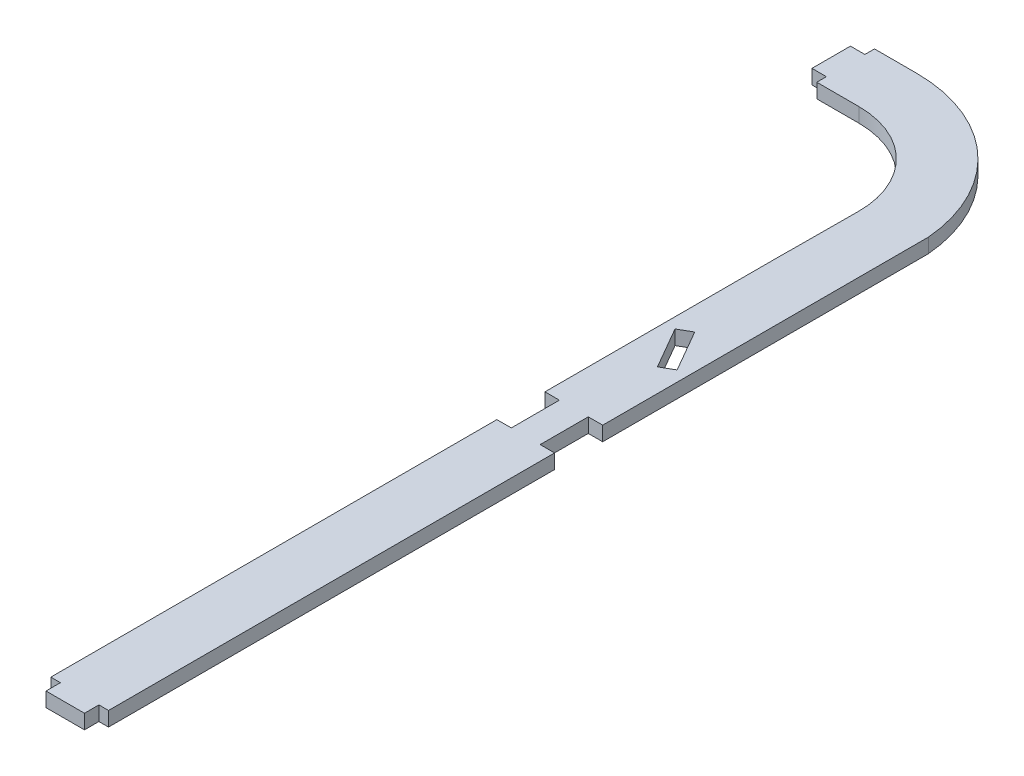
ISO-10303-21;
HEADER;
FILE_DESCRIPTION(('STEP AP214'),'2;1');
FILE_NAME('part.step','',(''),(''),'','','');
FILE_SCHEMA(('AUTOMOTIVE_DESIGN { 1 0 10303 214 1 1 1 1 }'));
ENDSEC;
DATA;
#1=APPLICATION_CONTEXT('core data for automotive mechanical design processes');
#2=APPLICATION_PROTOCOL_DEFINITION('international standard','automotive_design',2000,#1);
#3=PRODUCT_CONTEXT('',#1,'mechanical');
#4=PRODUCT('Part','Part','',(#3));
#5=PRODUCT_RELATED_PRODUCT_CATEGORY('part','',(#4));
#6=PRODUCT_DEFINITION_FORMATION('','',#4);
#7=PRODUCT_DEFINITION_CONTEXT('part definition',#1,'design');
#8=PRODUCT_DEFINITION('design','',#6,#7);
#9=PRODUCT_DEFINITION_SHAPE('','',#8);
#10=(LENGTH_UNIT() NAMED_UNIT(*) SI_UNIT(.MILLI.,.METRE.));
#11=(NAMED_UNIT(*) PLANE_ANGLE_UNIT() SI_UNIT($,.RADIAN.));
#12=(NAMED_UNIT(*) SI_UNIT($,.STERADIAN.) SOLID_ANGLE_UNIT());
#13=UNCERTAINTY_MEASURE_WITH_UNIT(LENGTH_MEASURE(1.E-05),#10,'distance_accuracy_value','');
#14=(GEOMETRIC_REPRESENTATION_CONTEXT(3) GLOBAL_UNCERTAINTY_ASSIGNED_CONTEXT((#13)) GLOBAL_UNIT_ASSIGNED_CONTEXT((#10,
#11,#12)) REPRESENTATION_CONTEXT('',''));
#15=CARTESIAN_POINT('',(0.,0.,0.));
#16=DIRECTION('',(0.,0.,1.));
#17=DIRECTION('',(1.,0.,0.));
#18=AXIS2_PLACEMENT_3D('',#15,#16,#17);
#19=CARTESIAN_POINT('',(43.2832423205118,3.,74.9687748154234));
#20=DIRECTION('',(0.500000000000092,0.,0.866025403784385));
#21=DIRECTION('',(0.866025403784385,0.,-0.500000000000093));
#22=AXIS2_PLACEMENT_3D('',#19,#20,#21);
#23=PLANE('',#22);
#24=DIRECTION('',(-0.866025403784385,0.,0.500000000000093));
#25=VECTOR('',#24,1.);
#26=CARTESIAN_POINT('',(43.2832423205118,0.,74.9687748154234));
#27=LINE('',#26,#25);
#28=CARTESIAN_POINT('',(69.7990381056764,0.,59.6598729810778));
#29=VERTEX_POINT('',#28);
#30=CARTESIAN_POINT('',(67.2009618943232,0.,61.159872981078));
#31=VERTEX_POINT('',#30);
#32=EDGE_CURVE('E322',#29,#31,#27,.T.);
#33=ORIENTED_EDGE('',*,*,#32,.F.);
#34=DIRECTION('',(0.,-1.,0.));
#35=VECTOR('',#34,1.);
#36=CARTESIAN_POINT('',(69.7990381056764,3.,59.6598729810778));
#37=LINE('',#36,#35);
#38=CARTESIAN_POINT('',(69.7990381056764,3.,59.6598729810778));
#39=VERTEX_POINT('',#38);
#40=EDGE_CURVE('E11',#39,#29,#37,.T.);
#41=ORIENTED_EDGE('',*,*,#40,.F.);
#42=DIRECTION('',(-0.866025403784385,0.,0.500000000000093));
#43=VECTOR('',#42,1.);
#44=CARTESIAN_POINT('',(43.2832423205118,3.,74.9687748154234));
#45=LINE('',#44,#43);
#46=CARTESIAN_POINT('',(67.2009618943232,3.,61.159872981078));
#47=VERTEX_POINT('',#46);
#48=EDGE_CURVE('E246',#39,#47,#45,.T.);
#49=ORIENTED_EDGE('',*,*,#48,.T.);
#50=DIRECTION('',(0.,-1.,0.));
#51=VECTOR('',#50,1.);
#52=CARTESIAN_POINT('',(67.2009618943232,3.,61.159872981078));
#53=LINE('',#52,#51);
#54=EDGE_CURVE('E54',#47,#31,#53,.T.);
#55=ORIENTED_EDGE('',*,*,#54,.T.);
#56=EDGE_LOOP('',(#33,#41,#49,#55));
#57=FACE_BOUND('',#56,.T.);
#58=ADVANCED_FACE('F35',(#57),#23,.T.);
#59=CARTESIAN_POINT('',(26.5157957851646,3.,-15.3089018343457));
#60=DIRECTION('',(0.866025403784386,0.,-0.500000000000092));
#61=DIRECTION('',(-0.500000000000092,0.,-0.866025403784386));
#62=AXIS2_PLACEMENT_3D('',#59,#60,#61);
#63=PLANE('',#62);
#64=DIRECTION('',(0.500000000000092,0.,0.866025403784386));
#65=VECTOR('',#64,1.);
#66=CARTESIAN_POINT('',(26.5157957851646,0.,-15.3089018343457));
#67=LINE('',#66,#65);
#68=CARTESIAN_POINT('',(74.7990381056773,0.,68.3201270189217));
#69=VERTEX_POINT('',#68);
#70=EDGE_CURVE('E251',#29,#69,#67,.T.);
#71=ORIENTED_EDGE('',*,*,#70,.T.);
#72=DIRECTION('',(0.,-1.,0.));
#73=VECTOR('',#72,1.);
#74=CARTESIAN_POINT('',(74.7990381056773,3.,68.3201270189217));
#75=LINE('',#74,#73);
#76=CARTESIAN_POINT('',(74.7990381056773,3.,68.3201270189217));
#77=VERTEX_POINT('',#76);
#78=EDGE_CURVE('E45',#77,#69,#75,.T.);
#79=ORIENTED_EDGE('',*,*,#78,.F.);
#80=DIRECTION('',(0.500000000000092,0.,0.866025403784386));
#81=VECTOR('',#80,1.);
#82=CARTESIAN_POINT('',(26.5157957851646,3.,-15.3089018343457));
#83=LINE('',#82,#81);
#84=EDGE_CURVE('E241',#39,#77,#83,.T.);
#85=ORIENTED_EDGE('',*,*,#84,.F.);
#86=ORIENTED_EDGE('',*,*,#40,.T.);
#87=EDGE_LOOP('',(#71,#79,#85,#86));
#88=FACE_BOUND('',#87,.T.);
#89=ADVANCED_FACE('F249',(#88),#63,.F.);
#90=CARTESIAN_POINT('',(48.2832423205124,3.,83.6290288532674));
#91=DIRECTION('',(0.500000000000089,0.,0.866025403784387));
#92=DIRECTION('',(0.866025403784387,0.,-0.500000000000089));
#93=AXIS2_PLACEMENT_3D('',#90,#91,#92);
#94=PLANE('',#93);
#95=DIRECTION('',(-0.866025403784387,0.,0.500000000000089));
#96=VECTOR('',#95,1.);
#97=CARTESIAN_POINT('',(48.2832423205124,0.,83.6290288532674));
#98=LINE('',#97,#96);
#99=CARTESIAN_POINT('',(72.2009618943241,0.,69.820127018922));
#100=VERTEX_POINT('',#99);
#101=EDGE_CURVE('E319',#69,#100,#98,.T.);
#102=ORIENTED_EDGE('',*,*,#101,.T.);
#103=DIRECTION('',(0.,-1.,0.));
#104=VECTOR('',#103,1.);
#105=CARTESIAN_POINT('',(72.2009618943241,3.,69.820127018922));
#106=LINE('',#105,#104);
#107=CARTESIAN_POINT('',(72.2009618943241,3.,69.820127018922));
#108=VERTEX_POINT('',#107);
#109=EDGE_CURVE('E143',#108,#100,#106,.T.);
#110=ORIENTED_EDGE('',*,*,#109,.F.);
#111=DIRECTION('',(-0.866025403784387,0.,0.500000000000089));
#112=VECTOR('',#111,1.);
#113=CARTESIAN_POINT('',(48.2832423205124,3.,83.6290288532674));
#114=LINE('',#113,#112);
#115=EDGE_CURVE('E233',#77,#108,#114,.T.);
#116=ORIENTED_EDGE('',*,*,#115,.F.);
#117=ORIENTED_EDGE('',*,*,#78,.T.);
#118=EDGE_LOOP('',(#102,#110,#116,#117));
#119=FACE_BOUND('',#118,.T.);
#120=ADVANCED_FACE('F235',(#119),#94,.F.);
#121=CARTESIAN_POINT('',(34.51,3.,0.));
#122=DIRECTION('',(-1.,0.,0.));
#123=DIRECTION('',(0.,0.,1.));
#124=AXIS2_PLACEMENT_3D('',#121,#122,#123);
#125=PLANE('',#124);
#126=DIRECTION('',(0.,0.,-1.));
#127=VECTOR('',#126,1.);
#128=CARTESIAN_POINT('',(34.51,0.,0.));
#129=LINE('',#128,#127);
#130=CARTESIAN_POINT('',(34.51,0.,0.));
#131=VERTEX_POINT('',#130);
#132=CARTESIAN_POINT('',(34.51,0.,-8.));
#133=VERTEX_POINT('',#132);
#134=EDGE_CURVE('E390',#131,#133,#129,.T.);
#135=ORIENTED_EDGE('',*,*,#134,.F.);
#136=DIRECTION('',(0.,-1.,0.));
#137=VECTOR('',#136,1.);
#138=CARTESIAN_POINT('',(34.51,3.,0.));
#139=LINE('',#138,#137);
#140=CARTESIAN_POINT('',(34.51,3.,0.));
#141=VERTEX_POINT('',#140);
#142=EDGE_CURVE('E39',#141,#131,#139,.T.);
#143=ORIENTED_EDGE('',*,*,#142,.F.);
#144=DIRECTION('',(0.,0.,-1.));
#145=VECTOR('',#144,1.);
#146=CARTESIAN_POINT('',(34.51,3.,0.));
#147=LINE('',#146,#145);
#148=CARTESIAN_POINT('',(34.51,3.,-8.));
#149=VERTEX_POINT('',#148);
#150=EDGE_CURVE('E318',#141,#149,#147,.T.);
#151=ORIENTED_EDGE('',*,*,#150,.T.);
#152=DIRECTION('',(0.,-1.,0.));
#153=VECTOR('',#152,1.);
#154=CARTESIAN_POINT('',(34.51,3.,-8.));
#155=LINE('',#154,#153);
#156=EDGE_CURVE('E256',#149,#133,#155,.T.);
#157=ORIENTED_EDGE('',*,*,#156,.T.);
#158=EDGE_LOOP('',(#135,#143,#151,#157));
#159=FACE_BOUND('',#158,.T.);
#160=ADVANCED_FACE('F37',(#159),#125,.T.);
#161=CARTESIAN_POINT('',(0.,3.,0.));
#162=DIRECTION('',(0.,0.,-1.));
#163=DIRECTION('',(-1.,0.,0.));
#164=AXIS2_PLACEMENT_3D('',#161,#162,#163);
#165=PLANE('',#164);
#166=DIRECTION('',(1.,0.,0.));
#167=VECTOR('',#166,1.);
#168=CARTESIAN_POINT('',(0.,0.,0.));
#169=LINE('',#168,#167);
#170=CARTESIAN_POINT('',(37.51,0.,0.));
#171=VERTEX_POINT('',#170);
#172=EDGE_CURVE('E388',#131,#171,#169,.T.);
#173=ORIENTED_EDGE('',*,*,#172,.T.);
#174=DIRECTION('',(0.,-1.,0.));
#175=VECTOR('',#174,1.);
#176=CARTESIAN_POINT('',(37.51,3.,0.));
#177=LINE('',#176,#175);
#178=CARTESIAN_POINT('',(37.51,3.,0.));
#179=VERTEX_POINT('',#178);
#180=EDGE_CURVE('E306',#179,#171,#177,.T.);
#181=ORIENTED_EDGE('',*,*,#180,.F.);
#182=DIRECTION('',(1.,0.,0.));
#183=VECTOR('',#182,1.);
#184=CARTESIAN_POINT('',(0.,3.,0.));
#185=LINE('',#184,#183);
#186=EDGE_CURVE('E454',#141,#179,#185,.T.);
#187=ORIENTED_EDGE('',*,*,#186,.F.);
#188=ORIENTED_EDGE('',*,*,#142,.T.);
#189=EDGE_LOOP('',(#173,#181,#187,#188));
#190=FACE_BOUND('',#189,.T.);
#191=ADVANCED_FACE('F469',(#190),#165,.F.);
#192=CARTESIAN_POINT('',(37.51,3.,0.));
#193=DIRECTION('',(1.,0.,0.));
#194=DIRECTION('',(0.,0.,-1.));
#195=AXIS2_PLACEMENT_3D('',#192,#193,#194);
#196=PLANE('',#195);
#197=DIRECTION('',(0.,0.,1.));
#198=VECTOR('',#197,1.);
#199=CARTESIAN_POINT('',(37.51,0.,0.));
#200=LINE('',#199,#198);
#201=CARTESIAN_POINT('',(37.51,0.,2.));
#202=VERTEX_POINT('',#201);
#203=EDGE_CURVE('E386',#171,#202,#200,.T.);
#204=ORIENTED_EDGE('',*,*,#203,.T.);
#205=DIRECTION('',(0.,-1.,0.));
#206=VECTOR('',#205,1.);
#207=CARTESIAN_POINT('',(37.51,3.,2.));
#208=LINE('',#207,#206);
#209=CARTESIAN_POINT('',(37.51,3.,2.));
#210=VERTEX_POINT('',#209);
#211=EDGE_CURVE('E304',#210,#202,#208,.T.);
#212=ORIENTED_EDGE('',*,*,#211,.F.);
#213=DIRECTION('',(0.,0.,1.));
#214=VECTOR('',#213,1.);
#215=CARTESIAN_POINT('',(37.51,3.,0.));
#216=LINE('',#215,#214);
#217=EDGE_CURVE('E452',#179,#210,#216,.T.);
#218=ORIENTED_EDGE('',*,*,#217,.F.);
#219=ORIENTED_EDGE('',*,*,#180,.T.);
#220=EDGE_LOOP('',(#204,#212,#218,#219));
#221=FACE_BOUND('',#220,.T.);
#222=ADVANCED_FACE('F471',(#221),#196,.F.);
#223=CARTESIAN_POINT('',(0.,3.,2.00000000000001));
#224=DIRECTION('',(0.,0.,-1.));
#225=DIRECTION('',(-1.,0.,0.));
#226=AXIS2_PLACEMENT_3D('',#223,#224,#225);
#227=PLANE('',#226);
#228=DIRECTION('',(1.,0.,0.));
#229=VECTOR('',#228,1.);
#230=CARTESIAN_POINT('',(0.,0.,2.00000000000001));
#231=LINE('',#230,#229);
#232=CARTESIAN_POINT('',(46.2512626584709,0.,2.));
#233=VERTEX_POINT('',#232);
#234=EDGE_CURVE('E383',#202,#233,#231,.T.);
#235=ORIENTED_EDGE('',*,*,#234,.T.);
#236=DIRECTION('',(0.,-1.,0.));
#237=VECTOR('',#236,1.);
#238=CARTESIAN_POINT('',(46.2512626584709,3.,2.));
#239=LINE('',#238,#237);
#240=CARTESIAN_POINT('',(46.2512626584709,3.,2.));
#241=VERTEX_POINT('',#240);
#242=EDGE_CURVE('E302',#241,#233,#239,.T.);
#243=ORIENTED_EDGE('',*,*,#242,.F.);
#244=DIRECTION('',(1.,0.,0.));
#245=VECTOR('',#244,1.);
#246=CARTESIAN_POINT('',(0.,3.,2.00000000000001));
#247=LINE('',#246,#245);
#248=EDGE_CURVE('E450',#210,#241,#247,.T.);
#249=ORIENTED_EDGE('',*,*,#248,.F.);
#250=ORIENTED_EDGE('',*,*,#211,.T.);
#251=EDGE_LOOP('',(#235,#243,#249,#250));
#252=FACE_BOUND('',#251,.T.);
#253=ADVANCED_FACE('F477',(#252),#227,.F.);
#254=CARTESIAN_POINT('',(46.2512626584709,3.,20.8556892131869));
#255=DIRECTION('',(0.,-1.,0.));
#256=DIRECTION('',(0.,0.,-1.));
#257=AXIS2_PLACEMENT_3D('',#254,#255,#256);
#258=CYLINDRICAL_SURFACE('',#257,18.8556892131869);
#259=CARTESIAN_POINT('',(46.2512626584709,0.,20.8556892131869));
#260=DIRECTION('',(0.,1.,0.));
#261=DIRECTION('',(0.,0.,1.));
#262=AXIS2_PLACEMENT_3D('',#259,#260,#261);
#263=CIRCLE('',#262,18.8556892131869);
#264=CARTESIAN_POINT('',(65.1055715405771,0.,21.0838389062047));
#265=VERTEX_POINT('',#264);
#266=EDGE_CURVE('E380',#265,#233,#263,.T.);
#267=ORIENTED_EDGE('',*,*,#266,.F.);
#268=DIRECTION('',(0.,-1.,0.));
#269=VECTOR('',#268,1.);
#270=CARTESIAN_POINT('',(65.1055715405771,3.,21.0838389062047));
#271=LINE('',#270,#269);
#272=CARTESIAN_POINT('',(65.1055715405771,3.,21.0838389062047));
#273=VERTEX_POINT('',#272);
#274=EDGE_CURVE('E300',#273,#265,#271,.T.);
#275=ORIENTED_EDGE('',*,*,#274,.F.);
#276=CARTESIAN_POINT('',(46.2512626584709,3.,20.8556892131869));
#277=DIRECTION('',(0.,1.,0.));
#278=DIRECTION('',(0.,0.,1.));
#279=AXIS2_PLACEMENT_3D('',#276,#277,#278);
#280=CIRCLE('',#279,18.8556892131869);
#281=EDGE_CURVE('E447',#273,#241,#280,.T.);
#282=ORIENTED_EDGE('',*,*,#281,.T.);
#283=ORIENTED_EDGE('',*,*,#242,.T.);
#284=EDGE_LOOP('',(#267,#275,#282,#283));
#285=FACE_BOUND('',#284,.T.);
#286=ADVANCED_FACE('F480',(#285),#258,.F.);
#287=CARTESIAN_POINT('',(65.2307434204492,3.,0.394653270711115));
#288=DIRECTION('',(-0.999981698577864,0.,-0.00605000077112861));
#289=DIRECTION('',(-0.00605000077112861,0.,0.999981698577864));
#290=AXIS2_PLACEMENT_3D('',#287,#288,#289);
#291=PLANE('',#290);
#292=DIRECTION('',(0.00605000077112861,0.,-0.999981698577864));
#293=VECTOR('',#292,1.);
#294=CARTESIAN_POINT('',(65.2307434204492,0.,0.394653270711115));
#295=LINE('',#294,#293);
#296=CARTESIAN_POINT('',(65.0000000000002,0.,38.5333587428506));
#297=VERTEX_POINT('',#296);
#298=EDGE_CURVE('E377',#297,#265,#295,.T.);
#299=ORIENTED_EDGE('',*,*,#298,.F.);
#300=DIRECTION('',(0.,-1.,0.));
#301=VECTOR('',#300,1.);
#302=CARTESIAN_POINT('',(65.0000000000002,3.,38.5333587428506));
#303=LINE('',#302,#301);
#304=CARTESIAN_POINT('',(65.0000000000002,3.,38.5333587428506));
#305=VERTEX_POINT('',#304);
#306=EDGE_CURVE('E298',#305,#297,#303,.T.);
#307=ORIENTED_EDGE('',*,*,#306,.F.);
#308=DIRECTION('',(0.00605000077112861,0.,-0.999981698577864));
#309=VECTOR('',#308,1.);
#310=CARTESIAN_POINT('',(65.2307434204492,3.,0.394653270711115));
#311=LINE('',#310,#309);
#312=EDGE_CURVE('E444',#305,#273,#311,.T.);
#313=ORIENTED_EDGE('',*,*,#312,.T.);
#314=ORIENTED_EDGE('',*,*,#274,.T.);
#315=EDGE_LOOP('',(#299,#307,#313,#314));
#316=FACE_BOUND('',#315,.T.);
#317=ADVANCED_FACE('F483',(#316),#291,.T.);
#318=CARTESIAN_POINT('',(65.0000000000003,3.,2.28048039705462E-13));
#319=DIRECTION('',(-1.,0.,0.));
#320=DIRECTION('',(0.,0.,1.));
#321=AXIS2_PLACEMENT_3D('',#318,#319,#320);
#322=PLANE('',#321);
#323=DIRECTION('',(0.,0.,-1.));
#324=VECTOR('',#323,1.);
#325=CARTESIAN_POINT('',(65.0000000000003,0.,2.28048039705462E-13));
#326=LINE('',#325,#324);
#327=CARTESIAN_POINT('',(65.,0.,86.));
#328=VERTEX_POINT('',#327);
#329=EDGE_CURVE('E374',#328,#297,#326,.T.);
#330=ORIENTED_EDGE('',*,*,#329,.F.);
#331=DIRECTION('',(0.,-1.,0.));
#332=VECTOR('',#331,1.);
#333=CARTESIAN_POINT('',(65.,3.,86.));
#334=LINE('',#333,#332);
#335=CARTESIAN_POINT('',(65.,3.,86.));
#336=VERTEX_POINT('',#335);
#337=EDGE_CURVE('E296',#336,#328,#334,.T.);
#338=ORIENTED_EDGE('',*,*,#337,.F.);
#339=DIRECTION('',(0.,0.,-1.));
#340=VECTOR('',#339,1.);
#341=CARTESIAN_POINT('',(65.0000000000003,3.,2.28048039705462E-13));
#342=LINE('',#341,#340);
#343=EDGE_CURVE('E441',#336,#305,#342,.T.);
#344=ORIENTED_EDGE('',*,*,#343,.T.);
#345=ORIENTED_EDGE('',*,*,#306,.T.);
#346=EDGE_LOOP('',(#330,#338,#344,#345));
#347=FACE_BOUND('',#346,.T.);
#348=ADVANCED_FACE('F487',(#347),#322,.T.);
#349=CARTESIAN_POINT('',(0.,3.,86.));
#350=DIRECTION('',(0.,0.,-1.));
#351=DIRECTION('',(-1.,0.,0.));
#352=AXIS2_PLACEMENT_3D('',#349,#350,#351);
#353=PLANE('',#352);
#354=DIRECTION('',(1.,0.,0.));
#355=VECTOR('',#354,1.);
#356=CARTESIAN_POINT('',(0.,0.,86.));
#357=LINE('',#356,#355);
#358=CARTESIAN_POINT('',(68.,0.,86.));
#359=VERTEX_POINT('',#358);
#360=EDGE_CURVE('E372',#328,#359,#357,.T.);
#361=ORIENTED_EDGE('',*,*,#360,.T.);
#362=DIRECTION('',(0.,-1.,0.));
#363=VECTOR('',#362,1.);
#364=CARTESIAN_POINT('',(68.,3.,86.));
#365=LINE('',#364,#363);
#366=CARTESIAN_POINT('',(68.,3.,86.));
#367=VERTEX_POINT('',#366);
#368=EDGE_CURVE('E293',#367,#359,#365,.T.);
#369=ORIENTED_EDGE('',*,*,#368,.F.);
#370=DIRECTION('',(1.,0.,0.));
#371=VECTOR('',#370,1.);
#372=CARTESIAN_POINT('',(0.,3.,86.));
#373=LINE('',#372,#371);
#374=EDGE_CURVE('E439',#336,#367,#373,.T.);
#375=ORIENTED_EDGE('',*,*,#374,.F.);
#376=ORIENTED_EDGE('',*,*,#337,.T.);
#377=EDGE_LOOP('',(#361,#369,#375,#376));
#378=FACE_BOUND('',#377,.T.);
#379=ADVANCED_FACE('F492',(#378),#353,.F.);
#380=CARTESIAN_POINT('',(68.,3.,0.));
#381=DIRECTION('',(1.,0.,0.));
#382=DIRECTION('',(0.,0.,-1.));
#383=AXIS2_PLACEMENT_3D('',#380,#381,#382);
#384=PLANE('',#383);
#385=DIRECTION('',(0.,0.,1.));
#386=VECTOR('',#385,1.);
#387=CARTESIAN_POINT('',(68.,0.,0.));
#388=LINE('',#387,#386);
#389=CARTESIAN_POINT('',(68.,0.,96.));
#390=VERTEX_POINT('',#389);
#391=EDGE_CURVE('E370',#359,#390,#388,.T.);
#392=ORIENTED_EDGE('',*,*,#391,.T.);
#393=DIRECTION('',(0.,-1.,0.));
#394=VECTOR('',#393,1.);
#395=CARTESIAN_POINT('',(68.,3.,96.));
#396=LINE('',#395,#394);
#397=CARTESIAN_POINT('',(68.,3.,96.));
#398=VERTEX_POINT('',#397);
#399=EDGE_CURVE('E290',#398,#390,#396,.T.);
#400=ORIENTED_EDGE('',*,*,#399,.F.);
#401=DIRECTION('',(0.,0.,1.));
#402=VECTOR('',#401,1.);
#403=CARTESIAN_POINT('',(68.,3.,0.));
#404=LINE('',#403,#402);
#405=EDGE_CURVE('E437',#367,#398,#404,.T.);
#406=ORIENTED_EDGE('',*,*,#405,.F.);
#407=ORIENTED_EDGE('',*,*,#368,.T.);
#408=EDGE_LOOP('',(#392,#400,#406,#407));
#409=FACE_BOUND('',#408,.T.);
#410=ADVANCED_FACE('F499',(#409),#384,.F.);
#411=CARTESIAN_POINT('',(0.,3.,96.));
#412=DIRECTION('',(0.,0.,1.));
#413=DIRECTION('',(1.,0.,0.));
#414=AXIS2_PLACEMENT_3D('',#411,#412,#413);
#415=PLANE('',#414);
#416=DIRECTION('',(-1.,0.,0.));
#417=VECTOR('',#416,1.);
#418=CARTESIAN_POINT('',(0.,0.,96.));
#419=LINE('',#418,#417);
#420=CARTESIAN_POINT('',(65.,0.,96.));
#421=VERTEX_POINT('',#420);
#422=EDGE_CURVE('E367',#390,#421,#419,.T.);
#423=ORIENTED_EDGE('',*,*,#422,.T.);
#424=DIRECTION('',(0.,-1.,0.));
#425=VECTOR('',#424,1.);
#426=CARTESIAN_POINT('',(65.,3.,96.));
#427=LINE('',#426,#425);
#428=CARTESIAN_POINT('',(65.,3.,96.));
#429=VERTEX_POINT('',#428);
#430=EDGE_CURVE('E288',#429,#421,#427,.T.);
#431=ORIENTED_EDGE('',*,*,#430,.F.);
#432=DIRECTION('',(-1.,0.,0.));
#433=VECTOR('',#432,1.);
#434=CARTESIAN_POINT('',(0.,3.,96.));
#435=LINE('',#434,#433);
#436=EDGE_CURVE('E435',#398,#429,#435,.T.);
#437=ORIENTED_EDGE('',*,*,#436,.F.);
#438=ORIENTED_EDGE('',*,*,#399,.T.);
#439=EDGE_LOOP('',(#423,#431,#437,#438));
#440=FACE_BOUND('',#439,.T.);
#441=ADVANCED_FACE('F503',(#440),#415,.F.);
#442=CARTESIAN_POINT('',(65.0000000000001,3.,0.));
#443=DIRECTION('',(-1.,0.,0.));
#444=DIRECTION('',(0.,0.,1.));
#445=AXIS2_PLACEMENT_3D('',#442,#443,#444);
#446=PLANE('',#445);
#447=DIRECTION('',(0.,0.,-1.));
#448=VECTOR('',#447,1.);
#449=CARTESIAN_POINT('',(65.0000000000001,0.,0.));
#450=LINE('',#449,#448);
#451=CARTESIAN_POINT('',(65.,0.,188.736951871658));
#452=VERTEX_POINT('',#451);
#453=EDGE_CURVE('E364',#452,#421,#450,.T.);
#454=ORIENTED_EDGE('',*,*,#453,.F.);
#455=DIRECTION('',(0.,-1.,0.));
#456=VECTOR('',#455,1.);
#457=CARTESIAN_POINT('',(65.,3.,188.736951871658));
#458=LINE('',#457,#456);
#459=CARTESIAN_POINT('',(65.,3.,188.736951871658));
#460=VERTEX_POINT('',#459);
#461=EDGE_CURVE('E286',#460,#452,#458,.T.);
#462=ORIENTED_EDGE('',*,*,#461,.F.);
#463=DIRECTION('',(0.,0.,-1.));
#464=VECTOR('',#463,1.);
#465=CARTESIAN_POINT('',(65.0000000000001,3.,0.));
#466=LINE('',#465,#464);
#467=EDGE_CURVE('E432',#460,#429,#466,.T.);
#468=ORIENTED_EDGE('',*,*,#467,.T.);
#469=ORIENTED_EDGE('',*,*,#430,.T.);
#470=EDGE_LOOP('',(#454,#462,#468,#469));
#471=FACE_BOUND('',#470,.T.);
#472=ADVANCED_FACE('F506',(#471),#446,.T.);
#473=CARTESIAN_POINT('',(0.,3.,188.736951871658));
#474=DIRECTION('',(0.,0.,-1.));
#475=DIRECTION('',(-1.,0.,0.));
#476=AXIS2_PLACEMENT_3D('',#473,#474,#475);
#477=PLANE('',#476);
#478=DIRECTION('',(1.,0.,0.));
#479=VECTOR('',#478,1.);
#480=CARTESIAN_POINT('',(0.,0.,188.736951871658));
#481=LINE('',#480,#479);
#482=CARTESIAN_POINT('',(67.,0.,188.736951871658));
#483=VERTEX_POINT('',#482);
#484=EDGE_CURVE('E361',#452,#483,#481,.T.);
#485=ORIENTED_EDGE('',*,*,#484,.T.);
#486=DIRECTION('',(0.,-1.,0.));
#487=VECTOR('',#486,1.);
#488=CARTESIAN_POINT('',(67.,3.,188.736951871658));
#489=LINE('',#488,#487);
#490=CARTESIAN_POINT('',(67.,3.,188.736951871658));
#491=VERTEX_POINT('',#490);
#492=EDGE_CURVE('E284',#491,#483,#489,.T.);
#493=ORIENTED_EDGE('',*,*,#492,.F.);
#494=DIRECTION('',(1.,0.,0.));
#495=VECTOR('',#494,1.);
#496=CARTESIAN_POINT('',(0.,3.,188.736951871658));
#497=LINE('',#496,#495);
#498=EDGE_CURVE('E430',#460,#491,#497,.T.);
#499=ORIENTED_EDGE('',*,*,#498,.F.);
#500=ORIENTED_EDGE('',*,*,#461,.T.);
#501=EDGE_LOOP('',(#485,#493,#499,#500));
#502=FACE_BOUND('',#501,.T.);
#503=ADVANCED_FACE('F512',(#502),#477,.F.);
#504=CARTESIAN_POINT('',(67.,3.,0.));
#505=DIRECTION('',(-1.,0.,0.));
#506=DIRECTION('',(0.,0.,1.));
#507=AXIS2_PLACEMENT_3D('',#504,#505,#506);
#508=PLANE('',#507);
#509=DIRECTION('',(0.,0.,-1.));
#510=VECTOR('',#509,1.);
#511=CARTESIAN_POINT('',(67.,0.,0.));
#512=LINE('',#511,#510);
#513=CARTESIAN_POINT('',(67.,0.,191.736951871658));
#514=VERTEX_POINT('',#513);
#515=EDGE_CURVE('E358',#514,#483,#512,.T.);
#516=ORIENTED_EDGE('',*,*,#515,.F.);
#517=DIRECTION('',(0.,-1.,0.));
#518=VECTOR('',#517,1.);
#519=CARTESIAN_POINT('',(67.,3.,191.736951871658));
#520=LINE('',#519,#518);
#521=CARTESIAN_POINT('',(67.,3.,191.736951871658));
#522=VERTEX_POINT('',#521);
#523=EDGE_CURVE('E282',#522,#514,#520,.T.);
#524=ORIENTED_EDGE('',*,*,#523,.F.);
#525=DIRECTION('',(0.,0.,-1.));
#526=VECTOR('',#525,1.);
#527=CARTESIAN_POINT('',(67.,3.,0.));
#528=LINE('',#527,#526);
#529=EDGE_CURVE('E427',#522,#491,#528,.T.);
#530=ORIENTED_EDGE('',*,*,#529,.T.);
#531=ORIENTED_EDGE('',*,*,#492,.T.);
#532=EDGE_LOOP('',(#516,#524,#530,#531));
#533=FACE_BOUND('',#532,.T.);
#534=ADVANCED_FACE('F516',(#533),#508,.T.);
#535=CARTESIAN_POINT('',(6.65221183248E-13,3.,191.736951871658));
#536=DIRECTION('',(0.,0.,1.));
#537=DIRECTION('',(1.,0.,0.));
#538=AXIS2_PLACEMENT_3D('',#535,#536,#537);
#539=PLANE('',#538);
#540=DIRECTION('',(-1.,0.,0.));
#541=VECTOR('',#540,1.);
#542=CARTESIAN_POINT('',(6.65221183248E-13,0.,191.736951871658));
#543=LINE('',#542,#541);
#544=CARTESIAN_POINT('',(75.,0.,191.736951871658));
#545=VERTEX_POINT('',#544);
#546=EDGE_CURVE('E355',#545,#514,#543,.T.);
#547=ORIENTED_EDGE('',*,*,#546,.F.);
#548=DIRECTION('',(0.,-1.,0.));
#549=VECTOR('',#548,1.);
#550=CARTESIAN_POINT('',(75.,3.,191.736951871658));
#551=LINE('',#550,#549);
#552=CARTESIAN_POINT('',(75.,3.,191.736951871658));
#553=VERTEX_POINT('',#552);
#554=EDGE_CURVE('E280',#553,#545,#551,.T.);
#555=ORIENTED_EDGE('',*,*,#554,.F.);
#556=DIRECTION('',(-1.,0.,0.));
#557=VECTOR('',#556,1.);
#558=CARTESIAN_POINT('',(6.65221183248E-13,3.,191.736951871658));
#559=LINE('',#558,#557);
#560=EDGE_CURVE('E424',#553,#522,#559,.T.);
#561=ORIENTED_EDGE('',*,*,#560,.T.);
#562=ORIENTED_EDGE('',*,*,#523,.T.);
#563=EDGE_LOOP('',(#547,#555,#561,#562));
#564=FACE_BOUND('',#563,.T.);
#565=ADVANCED_FACE('F519',(#564),#539,.T.);
#566=CARTESIAN_POINT('',(74.9999999999983,3.,-6.93889390390706E-13));
#567=DIRECTION('',(-1.,0.,0.));
#568=DIRECTION('',(0.,0.,1.));
#569=AXIS2_PLACEMENT_3D('',#566,#567,#568);
#570=PLANE('',#569);
#571=DIRECTION('',(0.,0.,-1.));
#572=VECTOR('',#571,1.);
#573=CARTESIAN_POINT('',(74.9999999999983,0.,-6.93889390390706E-13));
#574=LINE('',#573,#572);
#575=CARTESIAN_POINT('',(75.,0.,188.736951871658));
#576=VERTEX_POINT('',#575);
#577=EDGE_CURVE('E353',#545,#576,#574,.T.);
#578=ORIENTED_EDGE('',*,*,#577,.T.);
#579=DIRECTION('',(0.,-1.,0.));
#580=VECTOR('',#579,1.);
#581=CARTESIAN_POINT('',(75.,3.,188.736951871658));
#582=LINE('',#581,#580);
#583=CARTESIAN_POINT('',(75.,3.,188.736951871658));
#584=VERTEX_POINT('',#583);
#585=EDGE_CURVE('E277',#584,#576,#582,.T.);
#586=ORIENTED_EDGE('',*,*,#585,.F.);
#587=DIRECTION('',(0.,0.,-1.));
#588=VECTOR('',#587,1.);
#589=CARTESIAN_POINT('',(74.9999999999983,3.,-6.93889390390706E-13));
#590=LINE('',#589,#588);
#591=EDGE_CURVE('E422',#553,#584,#590,.T.);
#592=ORIENTED_EDGE('',*,*,#591,.F.);
#593=ORIENTED_EDGE('',*,*,#554,.T.);
#594=EDGE_LOOP('',(#578,#586,#592,#593));
#595=FACE_BOUND('',#594,.T.);
#596=ADVANCED_FACE('F525',(#595),#570,.F.);
#597=CARTESIAN_POINT('',(-2.61925136956852E-12,3.,188.736951871657));
#598=DIRECTION('',(0.,0.,-1.));
#599=DIRECTION('',(-1.,0.,0.));
#600=AXIS2_PLACEMENT_3D('',#597,#598,#599);
#601=PLANE('',#600);
#602=DIRECTION('',(1.,0.,0.));
#603=VECTOR('',#602,1.);
#604=CARTESIAN_POINT('',(-2.61925136956852E-12,0.,188.736951871657));
#605=LINE('',#604,#603);
#606=CARTESIAN_POINT('',(77.,0.,188.736951871658));
#607=VERTEX_POINT('',#606);
#608=EDGE_CURVE('E351',#576,#607,#605,.T.);
#609=ORIENTED_EDGE('',*,*,#608,.T.);
#610=DIRECTION('',(0.,-1.,0.));
#611=VECTOR('',#610,1.);
#612=CARTESIAN_POINT('',(77.,3.,188.736951871658));
#613=LINE('',#612,#611);
#614=CARTESIAN_POINT('',(77.,3.,188.736951871658));
#615=VERTEX_POINT('',#614);
#616=EDGE_CURVE('E274',#615,#607,#613,.T.);
#617=ORIENTED_EDGE('',*,*,#616,.F.);
#618=DIRECTION('',(1.,0.,0.));
#619=VECTOR('',#618,1.);
#620=CARTESIAN_POINT('',(-2.61925136956852E-12,3.,188.736951871657));
#621=LINE('',#620,#619);
#622=EDGE_CURVE('E420',#584,#615,#621,.T.);
#623=ORIENTED_EDGE('',*,*,#622,.F.);
#624=ORIENTED_EDGE('',*,*,#585,.T.);
#625=EDGE_LOOP('',(#609,#617,#623,#624));
#626=FACE_BOUND('',#625,.T.);
#627=ADVANCED_FACE('F529',(#626),#601,.F.);
#628=CARTESIAN_POINT('',(77.,3.,0.));
#629=DIRECTION('',(-1.,0.,0.));
#630=DIRECTION('',(0.,0.,1.));
#631=AXIS2_PLACEMENT_3D('',#628,#629,#630);
#632=PLANE('',#631);
#633=DIRECTION('',(0.,0.,-1.));
#634=VECTOR('',#633,1.);
#635=CARTESIAN_POINT('',(77.,0.,0.));
#636=LINE('',#635,#634);
#637=CARTESIAN_POINT('',(77.,0.,96.));
#638=VERTEX_POINT('',#637);
#639=EDGE_CURVE('E348',#607,#638,#636,.T.);
#640=ORIENTED_EDGE('',*,*,#639,.T.);
#641=DIRECTION('',(0.,-1.,0.));
#642=VECTOR('',#641,1.);
#643=CARTESIAN_POINT('',(77.,3.,96.));
#644=LINE('',#643,#642);
#645=CARTESIAN_POINT('',(77.,3.,96.));
#646=VERTEX_POINT('',#645);
#647=EDGE_CURVE('E272',#646,#638,#644,.T.);
#648=ORIENTED_EDGE('',*,*,#647,.F.);
#649=DIRECTION('',(0.,0.,-1.));
#650=VECTOR('',#649,1.);
#651=CARTESIAN_POINT('',(77.,3.,0.));
#652=LINE('',#651,#650);
#653=EDGE_CURVE('E418',#615,#646,#652,.T.);
#654=ORIENTED_EDGE('',*,*,#653,.F.);
#655=ORIENTED_EDGE('',*,*,#616,.T.);
#656=EDGE_LOOP('',(#640,#648,#654,#655));
#657=FACE_BOUND('',#656,.T.);
#658=ADVANCED_FACE('F534',(#657),#632,.F.);
#659=CARTESIAN_POINT('',(0.,3.,96.));
#660=DIRECTION('',(0.,0.,-1.));
#661=DIRECTION('',(-1.,0.,0.));
#662=AXIS2_PLACEMENT_3D('',#659,#660,#661);
#663=PLANE('',#662);
#664=DIRECTION('',(1.,0.,0.));
#665=VECTOR('',#664,1.);
#666=CARTESIAN_POINT('',(0.,0.,96.));
#667=LINE('',#666,#665);
#668=CARTESIAN_POINT('',(74.,0.,96.));
#669=VERTEX_POINT('',#668);
#670=EDGE_CURVE('E345',#669,#638,#667,.T.);
#671=ORIENTED_EDGE('',*,*,#670,.F.);
#672=DIRECTION('',(0.,-1.,0.));
#673=VECTOR('',#672,1.);
#674=CARTESIAN_POINT('',(74.,3.,96.));
#675=LINE('',#674,#673);
#676=CARTESIAN_POINT('',(74.,3.,96.));
#677=VERTEX_POINT('',#676);
#678=EDGE_CURVE('E270',#677,#669,#675,.T.);
#679=ORIENTED_EDGE('',*,*,#678,.F.);
#680=DIRECTION('',(1.,0.,0.));
#681=VECTOR('',#680,1.);
#682=CARTESIAN_POINT('',(0.,3.,96.));
#683=LINE('',#682,#681);
#684=EDGE_CURVE('E415',#677,#646,#683,.T.);
#685=ORIENTED_EDGE('',*,*,#684,.T.);
#686=ORIENTED_EDGE('',*,*,#647,.T.);
#687=EDGE_LOOP('',(#671,#679,#685,#686));
#688=FACE_BOUND('',#687,.T.);
#689=ADVANCED_FACE('F560',(#688),#663,.T.);
#690=CARTESIAN_POINT('',(74.,3.,0.));
#691=DIRECTION('',(1.,0.,0.));
#692=DIRECTION('',(0.,0.,-1.));
#693=AXIS2_PLACEMENT_3D('',#690,#691,#692);
#694=PLANE('',#693);
#695=DIRECTION('',(0.,0.,1.));
#696=VECTOR('',#695,1.);
#697=CARTESIAN_POINT('',(74.,0.,0.));
#698=LINE('',#697,#696);
#699=CARTESIAN_POINT('',(74.,0.,86.));
#700=VERTEX_POINT('',#699);
#701=EDGE_CURVE('E342',#700,#669,#698,.T.);
#702=ORIENTED_EDGE('',*,*,#701,.F.);
#703=DIRECTION('',(0.,-1.,0.));
#704=VECTOR('',#703,1.);
#705=CARTESIAN_POINT('',(74.,3.,86.));
#706=LINE('',#705,#704);
#707=CARTESIAN_POINT('',(74.,3.,86.));
#708=VERTEX_POINT('',#707);
#709=EDGE_CURVE('E268',#708,#700,#706,.T.);
#710=ORIENTED_EDGE('',*,*,#709,.F.);
#711=DIRECTION('',(0.,0.,1.));
#712=VECTOR('',#711,1.);
#713=CARTESIAN_POINT('',(74.,3.,0.));
#714=LINE('',#713,#712);
#715=EDGE_CURVE('E412',#708,#677,#714,.T.);
#716=ORIENTED_EDGE('',*,*,#715,.T.);
#717=ORIENTED_EDGE('',*,*,#678,.T.);
#718=EDGE_LOOP('',(#702,#710,#716,#717));
#719=FACE_BOUND('',#718,.T.);
#720=ADVANCED_FACE('F541',(#719),#694,.T.);
#721=CARTESIAN_POINT('',(0.,3.,86.));
#722=DIRECTION('',(0.,0.,1.));
#723=DIRECTION('',(1.,0.,0.));
#724=AXIS2_PLACEMENT_3D('',#721,#722,#723);
#725=PLANE('',#724);
#726=DIRECTION('',(-1.,0.,0.));
#727=VECTOR('',#726,1.);
#728=CARTESIAN_POINT('',(0.,0.,86.));
#729=LINE('',#728,#727);
#730=CARTESIAN_POINT('',(77.,0.,86.));
#731=VERTEX_POINT('',#730);
#732=EDGE_CURVE('E339',#731,#700,#729,.T.);
#733=ORIENTED_EDGE('',*,*,#732,.F.);
#734=DIRECTION('',(0.,-1.,0.));
#735=VECTOR('',#734,1.);
#736=CARTESIAN_POINT('',(77.,3.,86.));
#737=LINE('',#736,#735);
#738=CARTESIAN_POINT('',(77.,3.,86.));
#739=VERTEX_POINT('',#738);
#740=EDGE_CURVE('E266',#739,#731,#737,.T.);
#741=ORIENTED_EDGE('',*,*,#740,.F.);
#742=DIRECTION('',(-1.,0.,0.));
#743=VECTOR('',#742,1.);
#744=CARTESIAN_POINT('',(0.,3.,86.));
#745=LINE('',#744,#743);
#746=EDGE_CURVE('E409',#739,#708,#745,.T.);
#747=ORIENTED_EDGE('',*,*,#746,.T.);
#748=ORIENTED_EDGE('',*,*,#709,.T.);
#749=EDGE_LOOP('',(#733,#741,#747,#748));
#750=FACE_BOUND('',#749,.T.);
#751=ADVANCED_FACE('F545',(#750),#725,.T.);
#752=CARTESIAN_POINT('',(77.,3.,0.));
#753=DIRECTION('',(1.,0.,0.));
#754=DIRECTION('',(0.,0.,-1.));
#755=AXIS2_PLACEMENT_3D('',#752,#753,#754);
#756=PLANE('',#755);
#757=DIRECTION('',(0.,0.,1.));
#758=VECTOR('',#757,1.);
#759=CARTESIAN_POINT('',(77.,0.,0.));
#760=LINE('',#759,#758);
#761=CARTESIAN_POINT('',(77.,0.,18.2888412000724));
#762=VERTEX_POINT('',#761);
#763=EDGE_CURVE('E336',#762,#731,#760,.T.);
#764=ORIENTED_EDGE('',*,*,#763,.F.);
#765=DIRECTION('',(0.,-1.,0.));
#766=VECTOR('',#765,1.);
#767=CARTESIAN_POINT('',(77.,3.,18.2888412000724));
#768=LINE('',#767,#766);
#769=CARTESIAN_POINT('',(77.,3.,18.2888412000724));
#770=VERTEX_POINT('',#769);
#771=EDGE_CURVE('E264',#770,#762,#768,.T.);
#772=ORIENTED_EDGE('',*,*,#771,.F.);
#773=DIRECTION('',(0.,0.,1.));
#774=VECTOR('',#773,1.);
#775=CARTESIAN_POINT('',(77.,3.,0.));
#776=LINE('',#775,#774);
#777=EDGE_CURVE('E406',#770,#739,#776,.T.);
#778=ORIENTED_EDGE('',*,*,#777,.T.);
#779=ORIENTED_EDGE('',*,*,#740,.T.);
#780=EDGE_LOOP('',(#764,#772,#778,#779));
#781=FACE_BOUND('',#780,.T.);
#782=ADVANCED_FACE('F549',(#781),#756,.T.);
#783=CARTESIAN_POINT('',(46.2512626584709,3.,20.8556892131869));
#784=DIRECTION('',(0.,-1.,0.));
#785=DIRECTION('',(0.,0.,-1.));
#786=AXIS2_PLACEMENT_3D('',#783,#784,#785);
#787=CYLINDRICAL_SURFACE('',#786,30.8556892131869);
#788=CARTESIAN_POINT('',(46.2512626584709,0.,20.8556892131869));
#789=DIRECTION('',(0.,1.,0.));
#790=DIRECTION('',(0.,0.,1.));
#791=AXIS2_PLACEMENT_3D('',#788,#789,#790);
#792=CIRCLE('',#791,30.8556892131869);
#793=CARTESIAN_POINT('',(46.2512626584709,0.,-10.));
#794=VERTEX_POINT('',#793);
#795=EDGE_CURVE('E333',#762,#794,#792,.T.);
#796=ORIENTED_EDGE('',*,*,#795,.T.);
#797=DIRECTION('',(0.,-1.,0.));
#798=VECTOR('',#797,1.);
#799=CARTESIAN_POINT('',(46.2512626584709,3.,-10.));
#800=LINE('',#799,#798);
#801=CARTESIAN_POINT('',(46.2512626584709,3.,-10.));
#802=VERTEX_POINT('',#801);
#803=EDGE_CURVE('E262',#802,#794,#800,.T.);
#804=ORIENTED_EDGE('',*,*,#803,.F.);
#805=CARTESIAN_POINT('',(46.2512626584709,3.,20.8556892131869));
#806=DIRECTION('',(0.,1.,0.));
#807=DIRECTION('',(0.,0.,1.));
#808=AXIS2_PLACEMENT_3D('',#805,#806,#807);
#809=CIRCLE('',#808,30.8556892131869);
#810=EDGE_CURVE('E404',#770,#802,#809,.T.);
#811=ORIENTED_EDGE('',*,*,#810,.F.);
#812=ORIENTED_EDGE('',*,*,#771,.T.);
#813=EDGE_LOOP('',(#796,#804,#811,#812));
#814=FACE_BOUND('',#813,.T.);
#815=ADVANCED_FACE('F554',(#814),#787,.T.);
#816=CARTESIAN_POINT('',(0.,3.,-10.));
#817=DIRECTION('',(0.,0.,-1.));
#818=DIRECTION('',(-1.,0.,0.));
#819=AXIS2_PLACEMENT_3D('',#816,#817,#818);
#820=PLANE('',#819);
#821=DIRECTION('',(1.,0.,0.));
#822=VECTOR('',#821,1.);
#823=CARTESIAN_POINT('',(0.,0.,-10.));
#824=LINE('',#823,#822);
#825=CARTESIAN_POINT('',(37.51,0.,-10.));
#826=VERTEX_POINT('',#825);
#827=EDGE_CURVE('E330',#826,#794,#824,.T.);
#828=ORIENTED_EDGE('',*,*,#827,.F.);
#829=DIRECTION('',(0.,-1.,0.));
#830=VECTOR('',#829,1.);
#831=CARTESIAN_POINT('',(37.51,3.,-10.));
#832=LINE('',#831,#830);
#833=CARTESIAN_POINT('',(37.51,3.,-10.));
#834=VERTEX_POINT('',#833);
#835=EDGE_CURVE('E260',#834,#826,#832,.T.);
#836=ORIENTED_EDGE('',*,*,#835,.F.);
#837=DIRECTION('',(1.,0.,0.));
#838=VECTOR('',#837,1.);
#839=CARTESIAN_POINT('',(0.,3.,-10.));
#840=LINE('',#839,#838);
#841=EDGE_CURVE('E401',#834,#802,#840,.T.);
#842=ORIENTED_EDGE('',*,*,#841,.T.);
#843=ORIENTED_EDGE('',*,*,#803,.T.);
#844=EDGE_LOOP('',(#828,#836,#842,#843));
#845=FACE_BOUND('',#844,.T.);
#846=ADVANCED_FACE('F559',(#845),#820,.T.);
#847=CARTESIAN_POINT('',(37.51,3.,0.));
#848=DIRECTION('',(-1.,0.,0.));
#849=DIRECTION('',(0.,0.,1.));
#850=AXIS2_PLACEMENT_3D('',#847,#848,#849);
#851=PLANE('',#850);
#852=DIRECTION('',(0.,0.,-1.));
#853=VECTOR('',#852,1.);
#854=CARTESIAN_POINT('',(37.51,0.,0.));
#855=LINE('',#854,#853);
#856=CARTESIAN_POINT('',(37.51,0.,-8.));
#857=VERTEX_POINT('',#856);
#858=EDGE_CURVE('E327',#857,#826,#855,.T.);
#859=ORIENTED_EDGE('',*,*,#858,.F.);
#860=DIRECTION('',(0.,-1.,0.));
#861=VECTOR('',#860,1.);
#862=CARTESIAN_POINT('',(37.51,3.,-8.));
#863=LINE('',#862,#861);
#864=CARTESIAN_POINT('',(37.51,3.,-8.));
#865=VERTEX_POINT('',#864);
#866=EDGE_CURVE('E258',#865,#857,#863,.T.);
#867=ORIENTED_EDGE('',*,*,#866,.F.);
#868=DIRECTION('',(0.,0.,-1.));
#869=VECTOR('',#868,1.);
#870=CARTESIAN_POINT('',(37.51,3.,0.));
#871=LINE('',#870,#869);
#872=EDGE_CURVE('E398',#865,#834,#871,.T.);
#873=ORIENTED_EDGE('',*,*,#872,.T.);
#874=ORIENTED_EDGE('',*,*,#835,.T.);
#875=EDGE_LOOP('',(#859,#867,#873,#874));
#876=FACE_BOUND('',#875,.T.);
#877=ADVANCED_FACE('F557',(#876),#851,.T.);
#878=CARTESIAN_POINT('',(0.,3.,-8.));
#879=DIRECTION('',(0.,0.,-1.));
#880=DIRECTION('',(-1.,0.,0.));
#881=AXIS2_PLACEMENT_3D('',#878,#879,#880);
#882=PLANE('',#881);
#883=DIRECTION('',(1.,0.,0.));
#884=VECTOR('',#883,1.);
#885=CARTESIAN_POINT('',(0.,0.,-8.));
#886=LINE('',#885,#884);
#887=EDGE_CURVE('E324',#133,#857,#886,.T.);
#888=ORIENTED_EDGE('',*,*,#887,.F.);
#889=ORIENTED_EDGE('',*,*,#156,.F.);
#890=DIRECTION('',(1.,0.,0.));
#891=VECTOR('',#890,1.);
#892=CARTESIAN_POINT('',(0.,3.,-8.));
#893=LINE('',#892,#891);
#894=EDGE_CURVE('E395',#149,#865,#893,.T.);
#895=ORIENTED_EDGE('',*,*,#894,.T.);
#896=ORIENTED_EDGE('',*,*,#866,.T.);
#897=EDGE_LOOP('',(#888,#889,#895,#896));
#898=FACE_BOUND('',#897,.T.);
#899=ADVANCED_FACE('F463',(#898),#882,.T.);
#900=CARTESIAN_POINT('',(23.9177195738124,3.,-13.8089018343456));
#901=DIRECTION('',(0.866025403784391,0.,-0.500000000000082));
#902=DIRECTION('',(-0.500000000000082,0.,-0.866025403784391));
#903=AXIS2_PLACEMENT_3D('',#900,#901,#902);
#904=PLANE('',#903);
#905=DIRECTION('',(0.500000000000082,0.,0.866025403784391));
#906=VECTOR('',#905,1.);
#907=CARTESIAN_POINT('',(23.9177195738124,0.,-13.8089018343456));
#908=LINE('',#907,#906);
#909=EDGE_CURVE('E315',#31,#100,#908,.T.);
#910=ORIENTED_EDGE('',*,*,#909,.F.);
#911=ORIENTED_EDGE('',*,*,#54,.F.);
#912=DIRECTION('',(0.500000000000082,0.,0.866025403784391));
#913=VECTOR('',#912,1.);
#914=CARTESIAN_POINT('',(23.9177195738124,3.,-13.8089018343456));
#915=LINE('',#914,#913);
#916=EDGE_CURVE('E240',#47,#108,#915,.T.);
#917=ORIENTED_EDGE('',*,*,#916,.T.);
#918=ORIENTED_EDGE('',*,*,#109,.T.);
#919=EDGE_LOOP('',(#910,#911,#917,#918));
#920=FACE_BOUND('',#919,.T.);
#921=ADVANCED_FACE('F579',(#920),#904,.T.);
#922=CARTESIAN_POINT('',(0.,3.,0.));
#923=DIRECTION('',(0.,1.,0.));
#924=DIRECTION('',(0.,0.,1.));
#925=AXIS2_PLACEMENT_3D('',#922,#923,#924);
#926=PLANE('',#925);
#927=ORIENTED_EDGE('',*,*,#150,.F.);
#928=ORIENTED_EDGE('',*,*,#186,.T.);
#929=ORIENTED_EDGE('',*,*,#217,.T.);
#930=ORIENTED_EDGE('',*,*,#248,.T.);
#931=ORIENTED_EDGE('',*,*,#281,.F.);
#932=ORIENTED_EDGE('',*,*,#312,.F.);
#933=ORIENTED_EDGE('',*,*,#343,.F.);
#934=ORIENTED_EDGE('',*,*,#374,.T.);
#935=ORIENTED_EDGE('',*,*,#405,.T.);
#936=ORIENTED_EDGE('',*,*,#436,.T.);
#937=ORIENTED_EDGE('',*,*,#467,.F.);
#938=ORIENTED_EDGE('',*,*,#498,.T.);
#939=ORIENTED_EDGE('',*,*,#529,.F.);
#940=ORIENTED_EDGE('',*,*,#560,.F.);
#941=ORIENTED_EDGE('',*,*,#591,.T.);
#942=ORIENTED_EDGE('',*,*,#622,.T.);
#943=ORIENTED_EDGE('',*,*,#653,.T.);
#944=ORIENTED_EDGE('',*,*,#684,.F.);
#945=ORIENTED_EDGE('',*,*,#715,.F.);
#946=ORIENTED_EDGE('',*,*,#746,.F.);
#947=ORIENTED_EDGE('',*,*,#777,.F.);
#948=ORIENTED_EDGE('',*,*,#810,.T.);
#949=ORIENTED_EDGE('',*,*,#841,.F.);
#950=ORIENTED_EDGE('',*,*,#872,.F.);
#951=ORIENTED_EDGE('',*,*,#894,.F.);
#952=EDGE_LOOP('',(#927,#928,#929,#930,#931,#932,#933,#934,#935,#936,#937,#938,#939,#940,#941,
#942,#943,#944,#945,#946,#947,#948,#949,#950,#951));
#953=FACE_BOUND('',#952,.T.);
#954=ORIENTED_EDGE('',*,*,#48,.F.);
#955=ORIENTED_EDGE('',*,*,#84,.T.);
#956=ORIENTED_EDGE('',*,*,#115,.T.);
#957=ORIENTED_EDGE('',*,*,#916,.F.);
#958=EDGE_LOOP('',(#954,#955,#956,#957));
#959=FACE_BOUND('',#958,.T.);
#960=ADVANCED_FACE('F245',(#953,#959),#926,.T.);
#961=CARTESIAN_POINT('',(0.,0.,0.));
#962=DIRECTION('',(0.,1.,0.));
#963=DIRECTION('',(0.,0.,1.));
#964=AXIS2_PLACEMENT_3D('',#961,#962,#963);
#965=PLANE('',#964);
#966=ORIENTED_EDGE('',*,*,#134,.T.);
#967=ORIENTED_EDGE('',*,*,#887,.T.);
#968=ORIENTED_EDGE('',*,*,#858,.T.);
#969=ORIENTED_EDGE('',*,*,#827,.T.);
#970=ORIENTED_EDGE('',*,*,#795,.F.);
#971=ORIENTED_EDGE('',*,*,#763,.T.);
#972=ORIENTED_EDGE('',*,*,#732,.T.);
#973=ORIENTED_EDGE('',*,*,#701,.T.);
#974=ORIENTED_EDGE('',*,*,#670,.T.);
#975=ORIENTED_EDGE('',*,*,#639,.F.);
#976=ORIENTED_EDGE('',*,*,#608,.F.);
#977=ORIENTED_EDGE('',*,*,#577,.F.);
#978=ORIENTED_EDGE('',*,*,#546,.T.);
#979=ORIENTED_EDGE('',*,*,#515,.T.);
#980=ORIENTED_EDGE('',*,*,#484,.F.);
#981=ORIENTED_EDGE('',*,*,#453,.T.);
#982=ORIENTED_EDGE('',*,*,#422,.F.);
#983=ORIENTED_EDGE('',*,*,#391,.F.);
#984=ORIENTED_EDGE('',*,*,#360,.F.);
#985=ORIENTED_EDGE('',*,*,#329,.T.);
#986=ORIENTED_EDGE('',*,*,#298,.T.);
#987=ORIENTED_EDGE('',*,*,#266,.T.);
#988=ORIENTED_EDGE('',*,*,#234,.F.);
#989=ORIENTED_EDGE('',*,*,#203,.F.);
#990=ORIENTED_EDGE('',*,*,#172,.F.);
#991=EDGE_LOOP('',(#966,#967,#968,#969,#970,#971,#972,#973,#974,#975,#976,#977,#978,#979,#980,
#981,#982,#983,#984,#985,#986,#987,#988,#989,#990));
#992=FACE_BOUND('',#991,.T.);
#993=ORIENTED_EDGE('',*,*,#32,.T.);
#994=ORIENTED_EDGE('',*,*,#909,.T.);
#995=ORIENTED_EDGE('',*,*,#101,.F.);
#996=ORIENTED_EDGE('',*,*,#70,.F.);
#997=EDGE_LOOP('',(#993,#994,#995,#996));
#998=FACE_BOUND('',#997,.T.);
#999=ADVANCED_FACE('F466',(#992,#998),#965,.F.);
#1000=CLOSED_SHELL('',(#58,#89,#120,#160,#191,#222,#253,#286,#317,#348,#379,#410,#441,#472,#503,
#534,#565,#596,#627,#658,#689,#720,#751,#782,#815,#846,#877,#899,#921,#960,#999));
#1001=MANIFOLD_SOLID_BREP('B2',#1000);
#1002=ADVANCED_BREP_SHAPE_REPRESENTATION('',(#18,#1001),#14);
#1003=SHAPE_DEFINITION_REPRESENTATION(#9,#1002);
ENDSEC;
END-ISO-10303-21;
